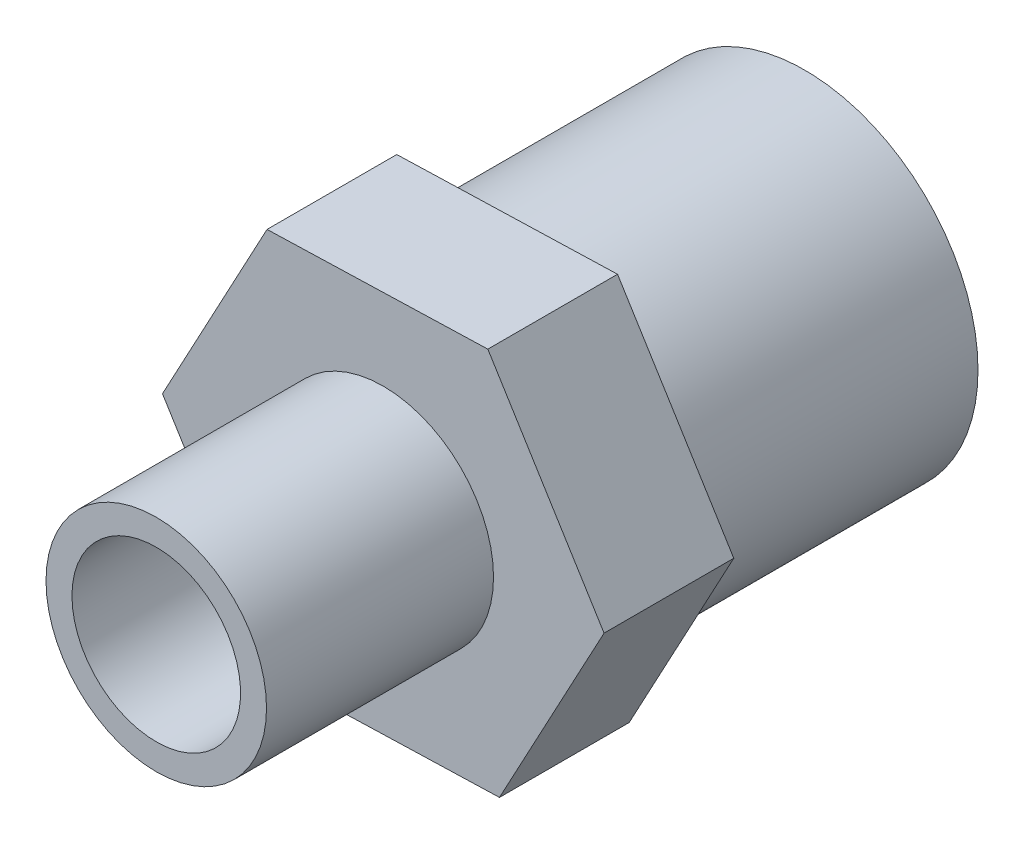
ISO-10303-21;
HEADER;
FILE_DESCRIPTION(('STEP AP214'),'2;1');
FILE_NAME('part.step','',(''),(''),'','','');
FILE_SCHEMA(('AUTOMOTIVE_DESIGN { 1 0 10303 214 1 1 1 1 }'));
ENDSEC;
DATA;
#1=APPLICATION_CONTEXT('core data for automotive mechanical design processes');
#2=APPLICATION_PROTOCOL_DEFINITION('international standard','automotive_design',2000,#1);
#3=PRODUCT_CONTEXT('',#1,'mechanical');
#4=PRODUCT('Part','Part','',(#3));
#5=PRODUCT_RELATED_PRODUCT_CATEGORY('part','',(#4));
#6=PRODUCT_DEFINITION_FORMATION('','',#4);
#7=PRODUCT_DEFINITION_CONTEXT('part definition',#1,'design');
#8=PRODUCT_DEFINITION('design','',#6,#7);
#9=PRODUCT_DEFINITION_SHAPE('','',#8);
#10=(LENGTH_UNIT() NAMED_UNIT(*) SI_UNIT(.MILLI.,.METRE.));
#11=(NAMED_UNIT(*) PLANE_ANGLE_UNIT() SI_UNIT($,.RADIAN.));
#12=(NAMED_UNIT(*) SI_UNIT($,.STERADIAN.) SOLID_ANGLE_UNIT());
#13=UNCERTAINTY_MEASURE_WITH_UNIT(LENGTH_MEASURE(1.E-05),#10,'distance_accuracy_value','');
#14=(GEOMETRIC_REPRESENTATION_CONTEXT(3) GLOBAL_UNCERTAINTY_ASSIGNED_CONTEXT((#13)) GLOBAL_UNIT_ASSIGNED_CONTEXT((#10,
#11,#12)) REPRESENTATION_CONTEXT('',''));
#15=CARTESIAN_POINT('',(0.,0.,0.));
#16=DIRECTION('',(0.,0.,1.));
#17=DIRECTION('',(1.,0.,0.));
#18=AXIS2_PLACEMENT_3D('',#15,#16,#17);
#19=CARTESIAN_POINT('',(0.,0.,22.5));
#20=DIRECTION('',(0.,0.,1.));
#21=DIRECTION('',(1.,0.,0.));
#22=AXIS2_PLACEMENT_3D('',#19,#20,#21);
#23=PLANE('',#22);
#24=CARTESIAN_POINT('',(0.,0.,22.5));
#25=DIRECTION('',(0.,0.,1.));
#26=DIRECTION('',(1.,0.,0.));
#27=AXIS2_PLACEMENT_3D('',#24,#25,#26);
#28=CIRCLE('',#27,8.5);
#29=CARTESIAN_POINT('',(-8.5,0.,22.5));
#30=VERTEX_POINT('',#29);
#31=EDGE_CURVE('E158',#30,#30,#28,.T.);
#32=ORIENTED_EDGE('',*,*,#31,.T.);
#33=EDGE_LOOP('',(#32));
#34=FACE_BOUND('',#33,.T.);
#35=CARTESIAN_POINT('',(0.,0.,22.5));
#36=DIRECTION('',(0.,0.,1.));
#37=DIRECTION('',(1.,0.,0.));
#38=AXIS2_PLACEMENT_3D('',#35,#36,#37);
#39=CIRCLE('',#38,6.5);
#40=CARTESIAN_POINT('',(-6.5,0.,22.5));
#41=VERTEX_POINT('',#40);
#42=EDGE_CURVE('E155',#41,#41,#39,.T.);
#43=ORIENTED_EDGE('',*,*,#42,.F.);
#44=EDGE_LOOP('',(#43));
#45=FACE_BOUND('',#44,.T.);
#46=ADVANCED_FACE('F46',(#34,#45),#23,.T.);
#47=CARTESIAN_POINT('',(0.,0.,22.5));
#48=DIRECTION('',(0.,0.,-1.));
#49=DIRECTION('',(-1.,0.,0.));
#50=AXIS2_PLACEMENT_3D('',#47,#48,#49);
#51=CYLINDRICAL_SURFACE('',#50,8.5);
#52=CARTESIAN_POINT('',(0.,0.,5.));
#53=DIRECTION('',(0.,0.,1.));
#54=DIRECTION('',(1.,0.,0.));
#55=AXIS2_PLACEMENT_3D('',#52,#53,#54);
#56=CIRCLE('',#55,8.5);
#57=CARTESIAN_POINT('',(-8.5,0.,5.00000000000001));
#58=VERTEX_POINT('',#57);
#59=EDGE_CURVE('E152',#58,#58,#56,.T.);
#60=CARTESIAN_POINT('',(-8.5,0.,5.00000000000001));
#61=CARTESIAN_POINT('',(-8.5,0.,5.18229166666667));
#62=CARTESIAN_POINT('',(-8.5,0.,5.36458333333334));
#63=CARTESIAN_POINT('',(-8.5,0.,5.72916666666667));
#64=CARTESIAN_POINT('',(-8.5,0.,5.91145833333334));
#65=CARTESIAN_POINT('',(-8.5,0.,6.27604166666667));
#66=CARTESIAN_POINT('',(-8.5,0.,6.45833333333334));
#67=CARTESIAN_POINT('',(-8.5,0.,6.82291666666667));
#68=CARTESIAN_POINT('',(-8.5,0.,7.00520833333334));
#69=CARTESIAN_POINT('',(-8.5,0.,7.36979166666667));
#70=CARTESIAN_POINT('',(-8.5,0.,7.55208333333333));
#71=CARTESIAN_POINT('',(-8.5,0.,7.91666666666667));
#72=CARTESIAN_POINT('',(-8.5,0.,8.09895833333333));
#73=CARTESIAN_POINT('',(-8.5,0.,8.46354166666666));
#74=CARTESIAN_POINT('',(-8.5,0.,8.64583333333333));
#75=CARTESIAN_POINT('',(-8.5,0.,9.01041666666666));
#76=CARTESIAN_POINT('',(-8.5,0.,9.19270833333333));
#77=CARTESIAN_POINT('',(-8.5,0.,9.55729166666666));
#78=CARTESIAN_POINT('',(-8.5,0.,9.73958333333333));
#79=CARTESIAN_POINT('',(-8.5,0.,10.1041666666667));
#80=CARTESIAN_POINT('',(-8.5,0.,10.2864583333333));
#81=CARTESIAN_POINT('',(-8.5,0.,10.6510416666667));
#82=CARTESIAN_POINT('',(-8.5,0.,10.8333333333333));
#83=CARTESIAN_POINT('',(-8.5,0.,11.1979166666667));
#84=CARTESIAN_POINT('',(-8.5,0.,11.3802083333333));
#85=CARTESIAN_POINT('',(-8.5,0.,11.7447916666667));
#86=CARTESIAN_POINT('',(-8.5,0.,11.9270833333333));
#87=CARTESIAN_POINT('',(-8.5,0.,12.2916666666667));
#88=CARTESIAN_POINT('',(-8.5,0.,12.4739583333333));
#89=CARTESIAN_POINT('',(-8.5,0.,12.8385416666667));
#90=CARTESIAN_POINT('',(-8.5,0.,13.0208333333333));
#91=CARTESIAN_POINT('',(-8.5,0.,13.3854166666667));
#92=CARTESIAN_POINT('',(-8.5,0.,13.5677083333333));
#93=CARTESIAN_POINT('',(-8.5,0.,13.9322916666667));
#94=CARTESIAN_POINT('',(-8.5,0.,14.1145833333333));
#95=CARTESIAN_POINT('',(-8.5,0.,14.4791666666667));
#96=CARTESIAN_POINT('',(-8.5,0.,14.6614583333333));
#97=CARTESIAN_POINT('',(-8.5,0.,15.0260416666667));
#98=CARTESIAN_POINT('',(-8.5,0.,15.2083333333333));
#99=CARTESIAN_POINT('',(-8.5,0.,15.5729166666667));
#100=CARTESIAN_POINT('',(-8.5,0.,15.7552083333333));
#101=CARTESIAN_POINT('',(-8.5,0.,16.1197916666667));
#102=CARTESIAN_POINT('',(-8.5,0.,16.3020833333333));
#103=CARTESIAN_POINT('',(-8.5,0.,16.6666666666667));
#104=CARTESIAN_POINT('',(-8.5,0.,16.8489583333333));
#105=CARTESIAN_POINT('',(-8.5,0.,17.2135416666666));
#106=CARTESIAN_POINT('',(-8.5,0.,17.3958333333333));
#107=CARTESIAN_POINT('',(-8.5,0.,17.7604166666666));
#108=CARTESIAN_POINT('',(-8.5,0.,17.9427083333333));
#109=CARTESIAN_POINT('',(-8.5,0.,18.3072916666666));
#110=CARTESIAN_POINT('',(-8.5,0.,18.4895833333333));
#111=CARTESIAN_POINT('',(-8.5,0.,18.8541666666666));
#112=CARTESIAN_POINT('',(-8.5,0.,19.0364583333333));
#113=CARTESIAN_POINT('',(-8.5,0.,19.4010416666666));
#114=CARTESIAN_POINT('',(-8.5,0.,19.5833333333333));
#115=CARTESIAN_POINT('',(-8.5,0.,19.9479166666666));
#116=CARTESIAN_POINT('',(-8.5,0.,20.1302083333333));
#117=CARTESIAN_POINT('',(-8.5,0.,20.4947916666666));
#118=CARTESIAN_POINT('',(-8.5,0.,20.6770833333333));
#119=CARTESIAN_POINT('',(-8.5,0.,21.0416666666666));
#120=CARTESIAN_POINT('',(-8.5,0.,21.2239583333333));
#121=CARTESIAN_POINT('',(-8.5,0.,21.5885416666666));
#122=CARTESIAN_POINT('',(-8.5,0.,21.7708333333333));
#123=CARTESIAN_POINT('',(-8.5,0.,22.1354166666666));
#124=CARTESIAN_POINT('',(-8.5,0.,22.3177083333333));
#125=CARTESIAN_POINT('',(-8.5,0.,22.5));
#126=B_SPLINE_CURVE_WITH_KNOTS('',3,(#60,#61,#62,#63,#64,#65,#66,#67,#68,#69,#70,#71,#72,#73,
#74,#75,#76,#77,#78,#79,#80,#81,#82,#83,#84,#85,#86,#87,#88,#89,#90,#91,#92,#93,#94,#95,#96,#97,
#98,#99,#100,#101,#102,#103,#104,#105,#106,#107,#108,#109,#110,#111,#112,#113,#114,#115,#116,
#117,#118,#119,#120,#121,#122,#123,#124,#125),.UNSPECIFIED.,.F.,.F.,(4,2,2,2,2,2,2,2,2,2,2,2,2,
2,2,2,2,2,2,2,2,2,2,2,2,2,2,2,2,2,2,2,4),(0.,0.546874999999999,1.09375,1.640625,
2.18749999999999,2.73437499999999,3.28124999999999,3.82812499999999,4.37499999999999,
4.92187499999999,5.46874999999999,6.01562499999998,6.56249999999998,7.10937499999998,
7.65624999999998,8.20312499999998,8.74999999999998,9.29687499999998,9.84374999999998,10.390625,
10.9375,11.484375,12.03125,12.578125,13.125,13.671875,14.21875,14.765625,15.3125,15.859375,
16.40625,16.953125,17.5),.UNSPECIFIED.);
#127=EDGE_CURVE('BSEAM48',#58,#30,#126,.T.);
#128=ORIENTED_EDGE('',*,*,#59,.T.);
#129=ORIENTED_EDGE('',*,*,#31,.F.);
#130=ORIENTED_EDGE('',*,*,#127,.T.);
#131=ORIENTED_EDGE('',*,*,#127,.F.);
#132=EDGE_LOOP('',(#128,#130,#129,#131));
#133=FACE_BOUND('',#132,.T.);
#134=ADVANCED_FACE('F48',(#133),#51,.T.);
#135=CARTESIAN_POINT('',(0.,0.,22.5));
#136=DIRECTION('',(0.,0.,-1.));
#137=DIRECTION('',(-1.,0.,0.));
#138=AXIS2_PLACEMENT_3D('',#135,#136,#137);
#139=CYLINDRICAL_SURFACE('',#138,6.5);
#140=CARTESIAN_POINT('',(0.,0.,5.));
#141=DIRECTION('',(0.,0.,1.));
#142=DIRECTION('',(1.,0.,0.));
#143=AXIS2_PLACEMENT_3D('',#140,#141,#142);
#144=CIRCLE('',#143,6.5);
#145=CARTESIAN_POINT('',(-6.5,0.,5.00000000000001));
#146=VERTEX_POINT('',#145);
#147=EDGE_CURVE('E55',#146,#146,#144,.T.);
#148=CARTESIAN_POINT('',(-6.5,0.,5.00000000000001));
#149=CARTESIAN_POINT('',(-6.5,0.,5.18229166666667));
#150=CARTESIAN_POINT('',(-6.5,0.,5.36458333333334));
#151=CARTESIAN_POINT('',(-6.5,0.,5.72916666666667));
#152=CARTESIAN_POINT('',(-6.5,0.,5.91145833333334));
#153=CARTESIAN_POINT('',(-6.5,0.,6.27604166666667));
#154=CARTESIAN_POINT('',(-6.5,0.,6.45833333333334));
#155=CARTESIAN_POINT('',(-6.5,0.,6.82291666666667));
#156=CARTESIAN_POINT('',(-6.5,0.,7.00520833333334));
#157=CARTESIAN_POINT('',(-6.5,0.,7.36979166666667));
#158=CARTESIAN_POINT('',(-6.5,0.,7.55208333333333));
#159=CARTESIAN_POINT('',(-6.5,0.,7.91666666666667));
#160=CARTESIAN_POINT('',(-6.5,0.,8.09895833333333));
#161=CARTESIAN_POINT('',(-6.5,0.,8.46354166666666));
#162=CARTESIAN_POINT('',(-6.5,0.,8.64583333333333));
#163=CARTESIAN_POINT('',(-6.5,0.,9.01041666666666));
#164=CARTESIAN_POINT('',(-6.5,0.,9.19270833333333));
#165=CARTESIAN_POINT('',(-6.5,0.,9.55729166666666));
#166=CARTESIAN_POINT('',(-6.5,0.,9.73958333333333));
#167=CARTESIAN_POINT('',(-6.5,0.,10.1041666666667));
#168=CARTESIAN_POINT('',(-6.5,0.,10.2864583333333));
#169=CARTESIAN_POINT('',(-6.5,0.,10.6510416666667));
#170=CARTESIAN_POINT('',(-6.5,0.,10.8333333333333));
#171=CARTESIAN_POINT('',(-6.5,0.,11.1979166666667));
#172=CARTESIAN_POINT('',(-6.5,0.,11.3802083333333));
#173=CARTESIAN_POINT('',(-6.5,0.,11.7447916666667));
#174=CARTESIAN_POINT('',(-6.5,0.,11.9270833333333));
#175=CARTESIAN_POINT('',(-6.5,0.,12.2916666666667));
#176=CARTESIAN_POINT('',(-6.5,0.,12.4739583333333));
#177=CARTESIAN_POINT('',(-6.5,0.,12.8385416666667));
#178=CARTESIAN_POINT('',(-6.5,0.,13.0208333333333));
#179=CARTESIAN_POINT('',(-6.5,0.,13.3854166666667));
#180=CARTESIAN_POINT('',(-6.5,0.,13.5677083333333));
#181=CARTESIAN_POINT('',(-6.5,0.,13.9322916666667));
#182=CARTESIAN_POINT('',(-6.5,0.,14.1145833333333));
#183=CARTESIAN_POINT('',(-6.5,0.,14.4791666666667));
#184=CARTESIAN_POINT('',(-6.5,0.,14.6614583333333));
#185=CARTESIAN_POINT('',(-6.5,0.,15.0260416666667));
#186=CARTESIAN_POINT('',(-6.5,0.,15.2083333333333));
#187=CARTESIAN_POINT('',(-6.5,0.,15.5729166666667));
#188=CARTESIAN_POINT('',(-6.5,0.,15.7552083333333));
#189=CARTESIAN_POINT('',(-6.5,0.,16.1197916666667));
#190=CARTESIAN_POINT('',(-6.5,0.,16.3020833333333));
#191=CARTESIAN_POINT('',(-6.5,0.,16.6666666666667));
#192=CARTESIAN_POINT('',(-6.5,0.,16.8489583333333));
#193=CARTESIAN_POINT('',(-6.5,0.,17.2135416666666));
#194=CARTESIAN_POINT('',(-6.5,0.,17.3958333333333));
#195=CARTESIAN_POINT('',(-6.5,0.,17.7604166666666));
#196=CARTESIAN_POINT('',(-6.5,0.,17.9427083333333));
#197=CARTESIAN_POINT('',(-6.5,0.,18.3072916666666));
#198=CARTESIAN_POINT('',(-6.5,0.,18.4895833333333));
#199=CARTESIAN_POINT('',(-6.5,0.,18.8541666666666));
#200=CARTESIAN_POINT('',(-6.5,0.,19.0364583333333));
#201=CARTESIAN_POINT('',(-6.5,0.,19.4010416666666));
#202=CARTESIAN_POINT('',(-6.5,0.,19.5833333333333));
#203=CARTESIAN_POINT('',(-6.5,0.,19.9479166666666));
#204=CARTESIAN_POINT('',(-6.5,0.,20.1302083333333));
#205=CARTESIAN_POINT('',(-6.5,0.,20.4947916666666));
#206=CARTESIAN_POINT('',(-6.5,0.,20.6770833333333));
#207=CARTESIAN_POINT('',(-6.5,0.,21.0416666666666));
#208=CARTESIAN_POINT('',(-6.5,0.,21.2239583333333));
#209=CARTESIAN_POINT('',(-6.5,0.,21.5885416666666));
#210=CARTESIAN_POINT('',(-6.5,0.,21.7708333333333));
#211=CARTESIAN_POINT('',(-6.5,0.,22.1354166666666));
#212=CARTESIAN_POINT('',(-6.5,0.,22.3177083333333));
#213=CARTESIAN_POINT('',(-6.5,0.,22.5));
#214=B_SPLINE_CURVE_WITH_KNOTS('',3,(#148,#149,#150,#151,#152,#153,#154,#155,#156,#157,#158,
#159,#160,#161,#162,#163,#164,#165,#166,#167,#168,#169,#170,#171,#172,#173,#174,#175,#176,#177,
#178,#179,#180,#181,#182,#183,#184,#185,#186,#187,#188,#189,#190,#191,#192,#193,#194,#195,#196,
#197,#198,#199,#200,#201,#202,#203,#204,#205,#206,#207,#208,#209,#210,#211,#212,#213),
.UNSPECIFIED.,.F.,.F.,(4,2,2,2,2,2,2,2,2,2,2,2,2,2,2,2,2,2,2,2,2,2,2,2,2,2,2,2,2,2,2,2,4),(0.,
0.546874999999999,1.09375,1.640625,2.18749999999999,2.73437499999999,3.28124999999999,
3.82812499999999,4.37499999999999,4.92187499999999,5.46874999999999,6.01562499999998,
6.56249999999998,7.10937499999998,7.65624999999998,8.20312499999998,8.74999999999998,
9.29687499999998,9.84374999999998,10.390625,10.9375,11.484375,12.03125,12.578125,13.125,
13.671875,14.21875,14.765625,15.3125,15.859375,16.40625,16.953125,17.5),.UNSPECIFIED.);
#215=EDGE_CURVE('BSEAM165',#146,#41,#214,.T.);
#216=ORIENTED_EDGE('',*,*,#147,.F.);
#217=ORIENTED_EDGE('',*,*,#42,.T.);
#218=ORIENTED_EDGE('',*,*,#215,.T.);
#219=ORIENTED_EDGE('',*,*,#215,.F.);
#220=EDGE_LOOP('',(#216,#218,#217,#219));
#221=FACE_BOUND('',#220,.T.);
#222=ADVANCED_FACE('F165',(#221),#139,.F.);
#223=CARTESIAN_POINT('',(0.,0.,5.));
#224=DIRECTION('',(0.,0.,1.));
#225=DIRECTION('',(1.,0.,0.));
#226=AXIS2_PLACEMENT_3D('',#223,#224,#225);
#227=PLANE('',#226);
#228=ORIENTED_EDGE('',*,*,#147,.T.);
#229=EDGE_LOOP('',(#228));
#230=FACE_BOUND('',#229,.T.);
#231=ADVANCED_FACE('F163',(#230),#227,.T.);
#232=CARTESIAN_POINT('',(8.9592743847966,-14.482081566582,5.00000000000012));
#233=DIRECTION('',(-0.880831416639054,0.473430053399272,0.));
#234=DIRECTION('',(-0.473430053399272,-0.880831416639054,0.));
#235=AXIS2_PLACEMENT_3D('',#232,#233,#234);
#236=PLANE('',#235);
#237=DIRECTION('',(0.473430053399272,0.880831416639054,0.));
#238=VECTOR('',#237,1.);
#239=CARTESIAN_POINT('',(8.95927438479616,-14.4820815665829,-5.));
#240=LINE('',#239,#238);
#241=CARTESIAN_POINT('',(8.95927438479616,-14.4820815665829,-5.));
#242=VERTEX_POINT('',#241);
#243=CARTESIAN_POINT('',(17.0214877287367,0.517918433417641,-4.99999999999989));
#244=VERTEX_POINT('',#243);
#245=EDGE_CURVE('E132',#242,#244,#240,.T.);
#246=ORIENTED_EDGE('',*,*,#245,.T.);
#247=DIRECTION('',(0.,0.,-1.));
#248=VECTOR('',#247,1.);
#249=CARTESIAN_POINT('',(17.0214877287367,0.517918433417641,5.));
#250=LINE('',#249,#248);
#251=CARTESIAN_POINT('',(17.0214877287367,0.517918433417641,5.));
#252=VERTEX_POINT('',#251);
#253=EDGE_CURVE('E150',#252,#244,#250,.T.);
#254=ORIENTED_EDGE('',*,*,#253,.F.);
#255=DIRECTION('',(0.473430053399272,0.880831416639054,0.));
#256=VECTOR('',#255,1.);
#257=CARTESIAN_POINT('',(8.9592743847966,-14.482081566582,5.00000000000012));
#258=LINE('',#257,#256);
#259=CARTESIAN_POINT('',(8.9592743847966,-14.482081566582,5.00000000000012));
#260=VERTEX_POINT('',#259);
#261=EDGE_CURVE('E143',#260,#252,#258,.T.);
#262=ORIENTED_EDGE('',*,*,#261,.F.);
#263=DIRECTION('',(0.,0.,-1.));
#264=VECTOR('',#263,1.);
#265=CARTESIAN_POINT('',(8.9592743847966,-14.482081566582,5.00000000000012));
#266=LINE('',#265,#264);
#267=EDGE_CURVE('E128',#260,#242,#266,.T.);
#268=ORIENTED_EDGE('',*,*,#267,.T.);
#269=EDGE_LOOP('',(#246,#254,#262,#268));
#270=FACE_BOUND('',#269,.T.);
#271=ADVANCED_FACE('F178',(#270),#236,.F.);
#272=CARTESIAN_POINT('',(17.0214877287367,0.517918433417641,5.));
#273=DIRECTION('',(-0.85041816147832,-0.52610735656122,0.));
#274=DIRECTION('',(0.52610735656122,-0.85041816147832,0.));
#275=AXIS2_PLACEMENT_3D('',#272,#273,#274);
#276=PLANE('',#275);
#277=DIRECTION('',(-0.52610735656122,0.85041816147832,0.));
#278=VECTOR('',#277,1.);
#279=CARTESIAN_POINT('',(17.0214877287367,0.517918433417641,-4.99999999999989));
#280=LINE('',#279,#278);
#281=CARTESIAN_POINT('',(8.06221334394053,14.9999999999997,-4.99999999999989));
#282=VERTEX_POINT('',#281);
#283=EDGE_CURVE('E135',#244,#282,#280,.T.);
#284=ORIENTED_EDGE('',*,*,#283,.T.);
#285=DIRECTION('',(0.,0.,-1.));
#286=VECTOR('',#285,1.);
#287=CARTESIAN_POINT('',(8.06221334394053,14.9999999999997,5.00000000000012));
#288=LINE('',#287,#286);
#289=CARTESIAN_POINT('',(8.06221334394053,14.9999999999997,5.00000000000012));
#290=VERTEX_POINT('',#289);
#291=EDGE_CURVE('E147',#290,#282,#288,.T.);
#292=ORIENTED_EDGE('',*,*,#291,.F.);
#293=DIRECTION('',(-0.52610735656122,0.85041816147832,0.));
#294=VECTOR('',#293,1.);
#295=CARTESIAN_POINT('',(17.0214877287367,0.517918433417641,5.));
#296=LINE('',#295,#294);
#297=EDGE_CURVE('E101',#252,#290,#296,.T.);
#298=ORIENTED_EDGE('',*,*,#297,.F.);
#299=ORIENTED_EDGE('',*,*,#253,.T.);
#300=EDGE_LOOP('',(#284,#292,#298,#299));
#301=FACE_BOUND('',#300,.T.);
#302=ADVANCED_FACE('F181',(#301),#276,.F.);
#303=CARTESIAN_POINT('',(8.06221334394053,14.9999999999997,5.00000000000012));
#304=DIRECTION('',(0.0304132551607337,-0.999537409960492,0.));
#305=DIRECTION('',(0.999537409960492,0.030413255160734,0.));
#306=AXIS2_PLACEMENT_3D('',#303,#304,#305);
#307=PLANE('',#306);
#308=DIRECTION('',(-0.999537409960492,-0.030413255160734,0.));
#309=VECTOR('',#308,1.);
#310=CARTESIAN_POINT('',(8.06221334394053,14.9999999999997,-4.99999999999989));
#311=LINE('',#310,#309);
#312=CARTESIAN_POINT('',(-8.9592743847966,14.4820815665812,-5.));
#313=VERTEX_POINT('',#312);
#314=EDGE_CURVE('E138',#282,#313,#311,.T.);
#315=ORIENTED_EDGE('',*,*,#314,.T.);
#316=DIRECTION('',(0.,0.,-1.));
#317=VECTOR('',#316,1.);
#318=CARTESIAN_POINT('',(-8.95927438479616,14.482081566582,5.00000000000012));
#319=LINE('',#318,#317);
#320=CARTESIAN_POINT('',(-8.95927438479616,14.482081566582,5.00000000000012));
#321=VERTEX_POINT('',#320);
#322=EDGE_CURVE('E123',#321,#313,#319,.T.);
#323=ORIENTED_EDGE('',*,*,#322,.F.);
#324=DIRECTION('',(-0.999537409960492,-0.030413255160734,0.));
#325=VECTOR('',#324,1.);
#326=CARTESIAN_POINT('',(8.06221334394053,14.9999999999997,5.00000000000012));
#327=LINE('',#326,#325);
#328=EDGE_CURVE('E114',#290,#321,#327,.T.);
#329=ORIENTED_EDGE('',*,*,#328,.F.);
#330=ORIENTED_EDGE('',*,*,#291,.T.);
#331=EDGE_LOOP('',(#315,#323,#329,#330));
#332=FACE_BOUND('',#331,.T.);
#333=ADVANCED_FACE('F185',(#332),#307,.F.);
#334=CARTESIAN_POINT('',(-8.95927438479616,14.482081566582,5.00000000000012));
#335=DIRECTION('',(0.880831416639054,-0.473430053399272,0.));
#336=DIRECTION('',(0.473430053399272,0.880831416639054,0.));
#337=AXIS2_PLACEMENT_3D('',#334,#335,#336);
#338=PLANE('',#337);
#339=DIRECTION('',(-0.473430053399272,-0.880831416639054,0.));
#340=VECTOR('',#339,1.);
#341=CARTESIAN_POINT('',(-8.9592743847966,14.4820815665812,-5.));
#342=LINE('',#341,#340);
#343=CARTESIAN_POINT('',(-17.0214877287367,-0.517918433418529,-5.));
#344=VERTEX_POINT('',#343);
#345=EDGE_CURVE('E122',#313,#344,#342,.T.);
#346=ORIENTED_EDGE('',*,*,#345,.T.);
#347=DIRECTION('',(0.,0.,-1.));
#348=VECTOR('',#347,1.);
#349=CARTESIAN_POINT('',(-17.0214877287367,-0.517918433418529,5.));
#350=LINE('',#349,#348);
#351=CARTESIAN_POINT('',(-17.0214877287367,-0.517918433418529,5.));
#352=VERTEX_POINT('',#351);
#353=EDGE_CURVE('E119',#352,#344,#350,.T.);
#354=ORIENTED_EDGE('',*,*,#353,.F.);
#355=DIRECTION('',(-0.473430053399272,-0.880831416639054,0.));
#356=VECTOR('',#355,1.);
#357=CARTESIAN_POINT('',(-8.95927438479616,14.482081566582,5.00000000000012));
#358=LINE('',#357,#356);
#359=EDGE_CURVE('E108',#321,#352,#358,.T.);
#360=ORIENTED_EDGE('',*,*,#359,.F.);
#361=ORIENTED_EDGE('',*,*,#322,.T.);
#362=EDGE_LOOP('',(#346,#354,#360,#361));
#363=FACE_BOUND('',#362,.T.);
#364=ADVANCED_FACE('F120',(#363),#338,.F.);
#365=CARTESIAN_POINT('',(-17.0214877287367,-0.517918433418529,5.));
#366=DIRECTION('',(0.85041816147832,0.52610735656122,0.));
#367=DIRECTION('',(-0.52610735656122,0.85041816147832,0.));
#368=AXIS2_PLACEMENT_3D('',#365,#366,#367);
#369=PLANE('',#368);
#370=DIRECTION('',(0.52610735656122,-0.85041816147832,0.));
#371=VECTOR('',#370,1.);
#372=CARTESIAN_POINT('',(-17.0214877287367,-0.517918433418529,-5.));
#373=LINE('',#372,#371);
#374=CARTESIAN_POINT('',(-8.06221334394008,-15.0000000000006,-5.));
#375=VERTEX_POINT('',#374);
#376=EDGE_CURVE('E86',#344,#375,#373,.T.);
#377=ORIENTED_EDGE('',*,*,#376,.T.);
#378=DIRECTION('',(0.,0.,-1.));
#379=VECTOR('',#378,1.);
#380=CARTESIAN_POINT('',(-8.06221334394008,-15.0000000000006,5.));
#381=LINE('',#380,#379);
#382=CARTESIAN_POINT('',(-8.06221334394008,-15.0000000000006,5.));
#383=VERTEX_POINT('',#382);
#384=EDGE_CURVE('E124',#383,#375,#381,.T.);
#385=ORIENTED_EDGE('',*,*,#384,.F.);
#386=DIRECTION('',(0.52610735656122,-0.85041816147832,0.));
#387=VECTOR('',#386,1.);
#388=CARTESIAN_POINT('',(-17.0214877287367,-0.517918433418529,5.));
#389=LINE('',#388,#387);
#390=EDGE_CURVE('E112',#352,#383,#389,.T.);
#391=ORIENTED_EDGE('',*,*,#390,.F.);
#392=ORIENTED_EDGE('',*,*,#353,.T.);
#393=EDGE_LOOP('',(#377,#385,#391,#392));
#394=FACE_BOUND('',#393,.T.);
#395=ADVANCED_FACE('F126',(#394),#369,.F.);
#396=CARTESIAN_POINT('',(-8.06221334394008,-15.0000000000006,5.));
#397=DIRECTION('',(-0.0304132551607337,0.999537409960492,0.));
#398=DIRECTION('',(-0.999537409960492,-0.030413255160734,0.));
#399=AXIS2_PLACEMENT_3D('',#396,#397,#398);
#400=PLANE('',#399);
#401=DIRECTION('',(0.999537409960492,0.030413255160734,0.));
#402=VECTOR('',#401,1.);
#403=CARTESIAN_POINT('',(-8.06221334394008,-15.0000000000006,-5.));
#404=LINE('',#403,#402);
#405=EDGE_CURVE('E92',#375,#242,#404,.T.);
#406=ORIENTED_EDGE('',*,*,#405,.T.);
#407=ORIENTED_EDGE('',*,*,#267,.F.);
#408=DIRECTION('',(0.999537409960492,0.030413255160734,0.));
#409=VECTOR('',#408,1.);
#410=CARTESIAN_POINT('',(-8.06221334394008,-15.0000000000006,5.));
#411=LINE('',#410,#409);
#412=EDGE_CURVE('E63',#383,#260,#411,.T.);
#413=ORIENTED_EDGE('',*,*,#412,.F.);
#414=ORIENTED_EDGE('',*,*,#384,.T.);
#415=EDGE_LOOP('',(#406,#407,#413,#414));
#416=FACE_BOUND('',#415,.T.);
#417=ADVANCED_FACE('F193',(#416),#400,.F.);
#418=ORIENTED_EDGE('',*,*,#59,.F.);
#419=EDGE_LOOP('',(#418));
#420=FACE_BOUND('',#419,.T.);
#421=ORIENTED_EDGE('',*,*,#261,.T.);
#422=ORIENTED_EDGE('',*,*,#297,.T.);
#423=ORIENTED_EDGE('',*,*,#328,.T.);
#424=ORIENTED_EDGE('',*,*,#359,.T.);
#425=ORIENTED_EDGE('',*,*,#390,.T.);
#426=ORIENTED_EDGE('',*,*,#412,.T.);
#427=EDGE_LOOP('',(#421,#422,#423,#424,#425,#426));
#428=FACE_BOUND('',#427,.T.);
#429=ADVANCED_FACE('F110',(#420,#428),#227,.T.);
#430=CARTESIAN_POINT('',(-4.44089209850063E-13,-8.88178419700125E-13,-5.));
#431=DIRECTION('',(0.,0.,1.));
#432=DIRECTION('',(1.,0.,0.));
#433=AXIS2_PLACEMENT_3D('',#430,#431,#432);
#434=PLANE('',#433);
#435=CARTESIAN_POINT('',(-4.44089209850063E-13,-8.88178419700125E-13,-5.));
#436=DIRECTION('',(0.,0.,1.));
#437=DIRECTION('',(1.,0.,0.));
#438=AXIS2_PLACEMENT_3D('',#435,#436,#437);
#439=CIRCLE('',#438,13.35);
#440=CARTESIAN_POINT('',(13.35,-8.86267448318989E-13,-5.00000000000001));
#441=VERTEX_POINT('',#440);
#442=EDGE_CURVE('E12',#441,#441,#439,.F.);
#443=ORIENTED_EDGE('',*,*,#442,.F.);
#444=EDGE_LOOP('',(#443));
#445=FACE_BOUND('',#444,.T.);
#446=ORIENTED_EDGE('',*,*,#245,.F.);
#447=ORIENTED_EDGE('',*,*,#405,.F.);
#448=ORIENTED_EDGE('',*,*,#376,.F.);
#449=ORIENTED_EDGE('',*,*,#345,.F.);
#450=ORIENTED_EDGE('',*,*,#314,.F.);
#451=ORIENTED_EDGE('',*,*,#283,.F.);
#452=EDGE_LOOP('',(#446,#447,#448,#449,#450,#451));
#453=FACE_BOUND('',#452,.T.);
#454=ADVANCED_FACE('F196',(#445,#453),#434,.F.);
#455=CARTESIAN_POINT('',(0.,-8.88178419700125E-13,-27.5));
#456=DIRECTION('',(0.,0.,-1.));
#457=DIRECTION('',(-1.,0.,0.));
#458=AXIS2_PLACEMENT_3D('',#455,#456,#457);
#459=PLANE('',#458);
#460=CARTESIAN_POINT('',(0.,-8.88178419700125E-13,-27.5));
#461=DIRECTION('',(0.,0.,-1.));
#462=DIRECTION('',(-1.,0.,0.));
#463=AXIS2_PLACEMENT_3D('',#460,#461,#462);
#464=CIRCLE('',#463,13.35);
#465=CARTESIAN_POINT('',(13.35,-8.85955198093313E-13,-27.5));
#466=VERTEX_POINT('',#465);
#467=EDGE_CURVE('E136',#466,#466,#464,.T.);
#468=ORIENTED_EDGE('',*,*,#467,.T.);
#469=EDGE_LOOP('',(#468));
#470=FACE_BOUND('',#469,.T.);
#471=CARTESIAN_POINT('',(0.,-8.88178419700125E-13,-27.5));
#472=DIRECTION('',(0.,0.,-1.));
#473=DIRECTION('',(-1.,0.,0.));
#474=AXIS2_PLACEMENT_3D('',#471,#472,#473);
#475=CIRCLE('',#474,10.65);
#476=CARTESIAN_POINT('',(10.65,-8.86404838418287E-13,-27.5));
#477=VERTEX_POINT('',#476);
#478=EDGE_CURVE('E222',#477,#477,#475,.T.);
#479=ORIENTED_EDGE('',*,*,#478,.F.);
#480=EDGE_LOOP('',(#479));
#481=FACE_BOUND('',#480,.T.);
#482=ADVANCED_FACE('F199',(#470,#481),#459,.T.);
#483=CARTESIAN_POINT('',(0.,-8.88178419700125E-13,-27.5));
#484=DIRECTION('',(0.,0.,1.));
#485=DIRECTION('',(1.,0.,0.));
#486=AXIS2_PLACEMENT_3D('',#483,#484,#485);
#487=CYLINDRICAL_SURFACE('',#486,13.35);
#488=CARTESIAN_POINT('',(13.35,-8.85955198093313E-13,-27.5));
#489=CARTESIAN_POINT('',(13.35,-8.85958450699831E-13,-27.265625));
#490=CARTESIAN_POINT('',(13.35,-8.85961703306348E-13,-27.03125));
#491=CARTESIAN_POINT('',(13.35,-8.85968208519383E-13,-26.5625));
#492=CARTESIAN_POINT('',(13.35,-8.85971461125901E-13,-26.328125));
#493=CARTESIAN_POINT('',(13.35,-8.85977966338935E-13,-25.859375));
#494=CARTESIAN_POINT('',(13.35,-8.85981218945453E-13,-25.625));
#495=CARTESIAN_POINT('',(13.35,-8.85987724158488E-13,-25.15625));
#496=CARTESIAN_POINT('',(13.35,-8.85990976765005E-13,-24.921875));
#497=CARTESIAN_POINT('',(13.35,-8.8599748197804E-13,-24.453125));
#498=CARTESIAN_POINT('',(13.35,-8.86000734584558E-13,-24.21875));
#499=CARTESIAN_POINT('',(13.35,-8.86007239797593E-13,-23.75));
#500=CARTESIAN_POINT('',(13.35,-8.8601049240411E-13,-23.515625));
#501=CARTESIAN_POINT('',(13.35,-8.86016997617145E-13,-23.046875));
#502=CARTESIAN_POINT('',(13.35,-8.86020250223663E-13,-22.8125));
#503=CARTESIAN_POINT('',(13.35,-8.86026755436697E-13,-22.34375));
#504=CARTESIAN_POINT('',(13.35,-8.86030008043215E-13,-22.109375));
#505=CARTESIAN_POINT('',(13.35,-8.8603651325625E-13,-21.640625));
#506=CARTESIAN_POINT('',(13.35,-8.86039765862767E-13,-21.40625));
#507=CARTESIAN_POINT('',(13.35,-8.86046271075802E-13,-20.9375));
#508=CARTESIAN_POINT('',(13.35,-8.8604952368232E-13,-20.703125));
#509=CARTESIAN_POINT('',(13.35,-8.86056028895354E-13,-20.234375));
#510=CARTESIAN_POINT('',(13.35,-8.86059281501872E-13,-20.));
#511=CARTESIAN_POINT('',(13.35,-8.86065786714907E-13,-19.53125));
#512=CARTESIAN_POINT('',(13.35,-8.86069039321424E-13,-19.296875));
#513=CARTESIAN_POINT('',(13.35,-8.86075544534459E-13,-18.828125));
#514=CARTESIAN_POINT('',(13.35,-8.86078797140977E-13,-18.59375));
#515=CARTESIAN_POINT('',(13.35,-8.86085302354012E-13,-18.125));
#516=CARTESIAN_POINT('',(13.35,-8.86088554960529E-13,-17.890625));
#517=CARTESIAN_POINT('',(13.35,-8.86095060173564E-13,-17.421875));
#518=CARTESIAN_POINT('',(13.35,-8.86098312780081E-13,-17.1875));
#519=CARTESIAN_POINT('',(13.35,-8.86104817993116E-13,-16.71875));
#520=CARTESIAN_POINT('',(13.35,-8.86108070599634E-13,-16.484375));
#521=CARTESIAN_POINT('',(13.35,-8.86114575812669E-13,-16.015625));
#522=CARTESIAN_POINT('',(13.35,-8.86117828419186E-13,-15.78125));
#523=CARTESIAN_POINT('',(13.35,-8.86124333632221E-13,-15.3125));
#524=CARTESIAN_POINT('',(13.35,-8.86127586238738E-13,-15.078125));
#525=CARTESIAN_POINT('',(13.35,-8.86134091451773E-13,-14.609375));
#526=CARTESIAN_POINT('',(13.35,-8.86137344058291E-13,-14.375));
#527=CARTESIAN_POINT('',(13.35,-8.86143849271326E-13,-13.90625));
#528=CARTESIAN_POINT('',(13.35,-8.86147101877843E-13,-13.671875));
#529=CARTESIAN_POINT('',(13.35,-8.86153607090878E-13,-13.203125));
#530=CARTESIAN_POINT('',(13.35,-8.86156859697396E-13,-12.96875));
#531=CARTESIAN_POINT('',(13.35,-8.86163364910431E-13,-12.5));
#532=CARTESIAN_POINT('',(13.35,-8.86166617516948E-13,-12.265625));
#533=CARTESIAN_POINT('',(13.35,-8.86173122729983E-13,-11.796875));
#534=CARTESIAN_POINT('',(13.35,-8.861763753365E-13,-11.5625));
#535=CARTESIAN_POINT('',(13.35,-8.86182880549535E-13,-11.09375));
#536=CARTESIAN_POINT('',(13.35,-8.86186133156053E-13,-10.859375));
#537=CARTESIAN_POINT('',(13.35,-8.86192638369088E-13,-10.390625));
#538=CARTESIAN_POINT('',(13.35,-8.86195890975605E-13,-10.15625));
#539=CARTESIAN_POINT('',(13.35,-8.8620239618864E-13,-9.6875));
#540=CARTESIAN_POINT('',(13.35,-8.86205648795158E-13,-9.453125));
#541=CARTESIAN_POINT('',(13.35,-8.86212154008192E-13,-8.984375));
#542=CARTESIAN_POINT('',(13.35,-8.8621540661471E-13,-8.75));
#543=CARTESIAN_POINT('',(13.35,-8.86221911827745E-13,-8.28125));
#544=CARTESIAN_POINT('',(13.35,-8.86225164434262E-13,-8.046875));
#545=CARTESIAN_POINT('',(13.35,-8.86231669647297E-13,-7.578125));
#546=CARTESIAN_POINT('',(13.35,-8.86234922253815E-13,-7.34375));
#547=CARTESIAN_POINT('',(13.35,-8.86241427466849E-13,-6.87500000000001));
#548=CARTESIAN_POINT('',(13.35,-8.86244680073367E-13,-6.64062500000001));
#549=CARTESIAN_POINT('',(13.35,-8.86251185286402E-13,-6.17187500000001));
#550=CARTESIAN_POINT('',(13.35,-8.86254437892919E-13,-5.93750000000001));
#551=CARTESIAN_POINT('',(13.35,-8.86260943105954E-13,-5.46875000000001));
#552=CARTESIAN_POINT('',(13.35,-8.86264195712472E-13,-5.23437500000001));
#553=CARTESIAN_POINT('',(13.35,-8.86267448318989E-13,-5.00000000000001));
#554=B_SPLINE_CURVE_WITH_KNOTS('',3,(#488,#489,#490,#491,#492,#493,#494,#495,#496,#497,#498,
#499,#500,#501,#502,#503,#504,#505,#506,#507,#508,#509,#510,#511,#512,#513,#514,#515,#516,#517,
#518,#519,#520,#521,#522,#523,#524,#525,#526,#527,#528,#529,#530,#531,#532,#533,#534,#535,#536,
#537,#538,#539,#540,#541,#542,#543,#544,#545,#546,#547,#548,#549,#550,#551,#552,#553),
.UNSPECIFIED.,.F.,.F.,(4,2,2,2,2,2,2,2,2,2,2,2,2,2,2,2,2,2,2,2,2,2,2,2,2,2,2,2,2,2,2,2,4),(0.,
0.703124999999995,1.40624999999999,2.10937499999999,2.81249999999999,3.51562499999999,
4.21874999999999,4.92187499999999,5.62499999999999,6.32812499999999,7.03124999999999,
7.73437499999998,8.43749999999998,9.14062499999998,9.84374999999998,10.546875,11.25,11.953125,
12.65625,13.359375,14.0625,14.765625,15.46875,16.171875,16.875,17.578125,18.28125,18.984375,
19.6875,20.390625,21.09375,21.796875,22.5),.UNSPECIFIED.);
#555=EDGE_CURVE('BSEAM205',#466,#441,#554,.T.);
#556=ORIENTED_EDGE('',*,*,#467,.F.);
#557=ORIENTED_EDGE('',*,*,#442,.T.);
#558=ORIENTED_EDGE('',*,*,#555,.T.);
#559=ORIENTED_EDGE('',*,*,#555,.F.);
#560=EDGE_LOOP('',(#556,#558,#557,#559));
#561=FACE_BOUND('',#560,.T.);
#562=ADVANCED_FACE('F205',(#561),#487,.T.);
#563=CARTESIAN_POINT('',(0.,-8.88178419700125E-13,-27.5));
#564=DIRECTION('',(0.,0.,1.));
#565=DIRECTION('',(1.,0.,0.));
#566=AXIS2_PLACEMENT_3D('',#563,#564,#565);
#567=CYLINDRICAL_SURFACE('',#566,10.65);
#568=CARTESIAN_POINT('',(-4.44089209850063E-13,-8.88178419700125E-13,-5.));
#569=DIRECTION('',(0.,0.,-1.));
#570=DIRECTION('',(-1.,0.,0.));
#571=AXIS2_PLACEMENT_3D('',#568,#569,#570);
#572=CIRCLE('',#571,10.65);
#573=CARTESIAN_POINT('',(10.65,-8.86717088643962E-13,-5.00000000000001));
#574=VERTEX_POINT('',#573);
#575=EDGE_CURVE('E225',#574,#574,#572,.T.);
#576=CARTESIAN_POINT('',(10.65,-8.86404838418287E-13,-27.5));
#577=CARTESIAN_POINT('',(10.65,-8.86408091024804E-13,-27.265625));
#578=CARTESIAN_POINT('',(10.65,-8.86411343631322E-13,-27.03125));
#579=CARTESIAN_POINT('',(10.65,-8.86417848844356E-13,-26.5625));
#580=CARTESIAN_POINT('',(10.65,-8.86421101450874E-13,-26.328125));
#581=CARTESIAN_POINT('',(10.65,-8.86427606663909E-13,-25.859375));
#582=CARTESIAN_POINT('',(10.65,-8.86430859270426E-13,-25.625));
#583=CARTESIAN_POINT('',(10.65,-8.86437364483461E-13,-25.15625));
#584=CARTESIAN_POINT('',(10.65,-8.86440617089979E-13,-24.921875));
#585=CARTESIAN_POINT('',(10.65,-8.86447122303013E-13,-24.453125));
#586=CARTESIAN_POINT('',(10.65,-8.86450374909531E-13,-24.21875));
#587=CARTESIAN_POINT('',(10.65,-8.86456880122566E-13,-23.75));
#588=CARTESIAN_POINT('',(10.65,-8.86460132729083E-13,-23.515625));
#589=CARTESIAN_POINT('',(10.65,-8.86466637942118E-13,-23.046875));
#590=CARTESIAN_POINT('',(10.65,-8.86469890548636E-13,-22.8125));
#591=CARTESIAN_POINT('',(10.65,-8.86476395761671E-13,-22.34375));
#592=CARTESIAN_POINT('',(10.65,-8.86479648368188E-13,-22.109375));
#593=CARTESIAN_POINT('',(10.65,-8.86486153581223E-13,-21.640625));
#594=CARTESIAN_POINT('',(10.65,-8.8648940618774E-13,-21.40625));
#595=CARTESIAN_POINT('',(10.65,-8.86495911400775E-13,-20.9375));
#596=CARTESIAN_POINT('',(10.65,-8.86499164007293E-13,-20.703125));
#597=CARTESIAN_POINT('',(10.65,-8.86505669220328E-13,-20.234375));
#598=CARTESIAN_POINT('',(10.65,-8.86508921826845E-13,-20.));
#599=CARTESIAN_POINT('',(10.65,-8.8651542703988E-13,-19.53125));
#600=CARTESIAN_POINT('',(10.65,-8.86518679646398E-13,-19.296875));
#601=CARTESIAN_POINT('',(10.65,-8.86525184859432E-13,-18.828125));
#602=CARTESIAN_POINT('',(10.65,-8.8652843746595E-13,-18.59375));
#603=CARTESIAN_POINT('',(10.65,-8.86534942678985E-13,-18.125));
#604=CARTESIAN_POINT('',(10.65,-8.86538195285502E-13,-17.890625));
#605=CARTESIAN_POINT('',(10.65,-8.86544700498537E-13,-17.421875));
#606=CARTESIAN_POINT('',(10.65,-8.86547953105055E-13,-17.1875));
#607=CARTESIAN_POINT('',(10.65,-8.8655445831809E-13,-16.71875));
#608=CARTESIAN_POINT('',(10.65,-8.86557710924607E-13,-16.484375));
#609=CARTESIAN_POINT('',(10.65,-8.86564216137642E-13,-16.015625));
#610=CARTESIAN_POINT('',(10.65,-8.86567468744159E-13,-15.78125));
#611=CARTESIAN_POINT('',(10.65,-8.86573973957194E-13,-15.3125));
#612=CARTESIAN_POINT('',(10.65,-8.86577226563712E-13,-15.078125));
#613=CARTESIAN_POINT('',(10.65,-8.86583731776747E-13,-14.609375));
#614=CARTESIAN_POINT('',(10.65,-8.86586984383264E-13,-14.375));
#615=CARTESIAN_POINT('',(10.65,-8.86593489596299E-13,-13.90625));
#616=CARTESIAN_POINT('',(10.65,-8.86596742202817E-13,-13.671875));
#617=CARTESIAN_POINT('',(10.65,-8.86603247415851E-13,-13.203125));
#618=CARTESIAN_POINT('',(10.65,-8.86606500022369E-13,-12.96875));
#619=CARTESIAN_POINT('',(10.65,-8.86613005235404E-13,-12.5));
#620=CARTESIAN_POINT('',(10.65,-8.86616257841921E-13,-12.265625));
#621=CARTESIAN_POINT('',(10.65,-8.86622763054956E-13,-11.796875));
#622=CARTESIAN_POINT('',(10.65,-8.86626015661474E-13,-11.5625));
#623=CARTESIAN_POINT('',(10.65,-8.86632520874508E-13,-11.09375));
#624=CARTESIAN_POINT('',(10.65,-8.86635773481026E-13,-10.859375));
#625=CARTESIAN_POINT('',(10.65,-8.86642278694061E-13,-10.390625));
#626=CARTESIAN_POINT('',(10.65,-8.86645531300578E-13,-10.15625));
#627=CARTESIAN_POINT('',(10.65,-8.86652036513613E-13,-9.6875));
#628=CARTESIAN_POINT('',(10.65,-8.86655289120131E-13,-9.453125));
#629=CARTESIAN_POINT('',(10.65,-8.86661794333166E-13,-8.984375));
#630=CARTESIAN_POINT('',(10.65,-8.86665046939683E-13,-8.75));
#631=CARTESIAN_POINT('',(10.65,-8.86671552152718E-13,-8.28125));
#632=CARTESIAN_POINT('',(10.65,-8.86674804759235E-13,-8.046875));
#633=CARTESIAN_POINT('',(10.65,-8.8668130997227E-13,-7.578125));
#634=CARTESIAN_POINT('',(10.65,-8.86684562578788E-13,-7.34375));
#635=CARTESIAN_POINT('',(10.65,-8.86691067791823E-13,-6.87500000000001));
#636=CARTESIAN_POINT('',(10.65,-8.8669432039834E-13,-6.64062500000001));
#637=CARTESIAN_POINT('',(10.65,-8.86700825611375E-13,-6.17187500000001));
#638=CARTESIAN_POINT('',(10.65,-8.86704078217893E-13,-5.93750000000001));
#639=CARTESIAN_POINT('',(10.65,-8.86710583430927E-13,-5.46875000000001));
#640=CARTESIAN_POINT('',(10.65,-8.86713836037445E-13,-5.23437500000001));
#641=CARTESIAN_POINT('',(10.65,-8.86717088643962E-13,-5.00000000000001));
#642=B_SPLINE_CURVE_WITH_KNOTS('',3,(#576,#577,#578,#579,#580,#581,#582,#583,#584,#585,#586,
#587,#588,#589,#590,#591,#592,#593,#594,#595,#596,#597,#598,#599,#600,#601,#602,#603,#604,#605,
#606,#607,#608,#609,#610,#611,#612,#613,#614,#615,#616,#617,#618,#619,#620,#621,#622,#623,#624,
#625,#626,#627,#628,#629,#630,#631,#632,#633,#634,#635,#636,#637,#638,#639,#640,#641),
.UNSPECIFIED.,.F.,.F.,(4,2,2,2,2,2,2,2,2,2,2,2,2,2,2,2,2,2,2,2,2,2,2,2,2,2,2,2,2,2,2,2,4),(0.,
0.703124999999995,1.40624999999999,2.10937499999999,2.81249999999999,3.51562499999999,
4.21874999999999,4.92187499999999,5.62499999999999,6.32812499999999,7.03124999999999,
7.73437499999998,8.43749999999998,9.14062499999998,9.84374999999998,10.546875,11.25,11.953125,
12.65625,13.359375,14.0625,14.765625,15.46875,16.171875,16.875,17.578125,18.28125,18.984375,
19.6875,20.390625,21.09375,21.796875,22.5),.UNSPECIFIED.);
#643=EDGE_CURVE('BSEAM208',#477,#574,#642,.T.);
#644=ORIENTED_EDGE('',*,*,#478,.T.);
#645=ORIENTED_EDGE('',*,*,#575,.F.);
#646=ORIENTED_EDGE('',*,*,#643,.T.);
#647=ORIENTED_EDGE('',*,*,#643,.F.);
#648=EDGE_LOOP('',(#644,#646,#645,#647));
#649=FACE_BOUND('',#648,.T.);
#650=ADVANCED_FACE('F208',(#649),#567,.F.);
#651=ORIENTED_EDGE('',*,*,#575,.T.);
#652=EDGE_LOOP('',(#651));
#653=FACE_BOUND('',#652,.T.);
#654=ADVANCED_FACE('F201',(#653),#434,.F.);
#655=CLOSED_SHELL('',(#46,#134,#222,#231,#271,#302,#333,#364,#395,#417,#429,#454,#482,#562,#650,#654));
#656=MANIFOLD_SOLID_BREP('B2',#655);
#657=ADVANCED_BREP_SHAPE_REPRESENTATION('',(#18,#656),#14);
#658=SHAPE_DEFINITION_REPRESENTATION(#9,#657);
ENDSEC;
END-ISO-10303-21;
